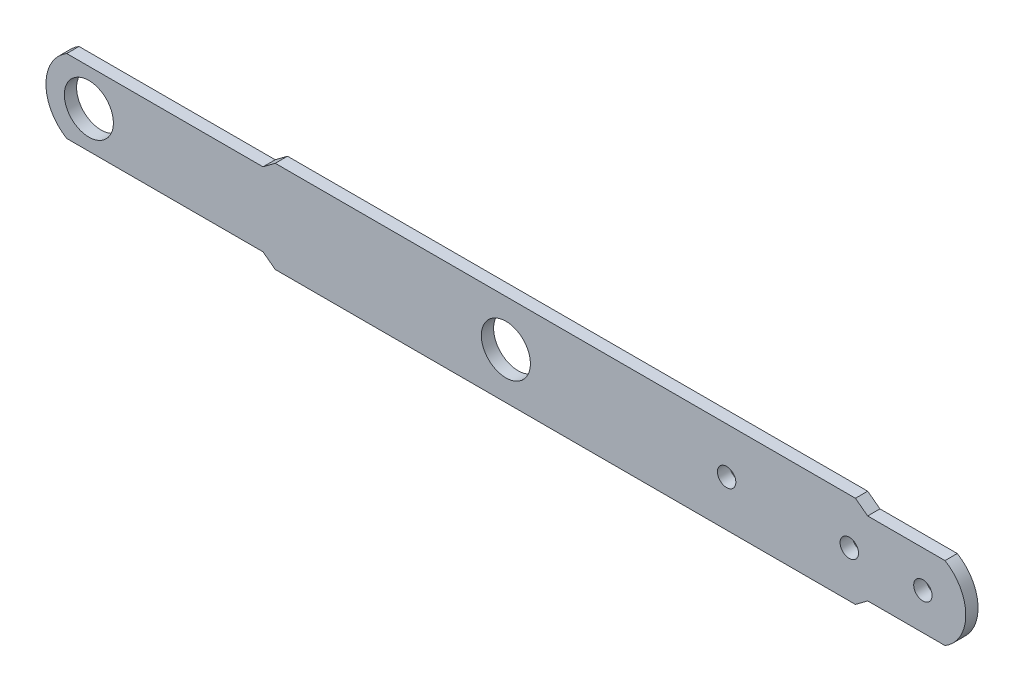
ISO-10303-21;
HEADER;
FILE_DESCRIPTION(('STEP AP214'),'2;1');
FILE_NAME('part.step','',(''),(''),'','','');
FILE_SCHEMA(('AUTOMOTIVE_DESIGN { 1 0 10303 214 1 1 1 1 }'));
ENDSEC;
DATA;
#1=APPLICATION_CONTEXT('core data for automotive mechanical design processes');
#2=APPLICATION_PROTOCOL_DEFINITION('international standard','automotive_design',2000,#1);
#3=PRODUCT_CONTEXT('',#1,'mechanical');
#4=PRODUCT('Part','Part','',(#3));
#5=PRODUCT_RELATED_PRODUCT_CATEGORY('part','',(#4));
#6=PRODUCT_DEFINITION_FORMATION('','',#4);
#7=PRODUCT_DEFINITION_CONTEXT('part definition',#1,'design');
#8=PRODUCT_DEFINITION('design','',#6,#7);
#9=PRODUCT_DEFINITION_SHAPE('','',#8);
#10=(LENGTH_UNIT() NAMED_UNIT(*) SI_UNIT(.MILLI.,.METRE.));
#11=(NAMED_UNIT(*) PLANE_ANGLE_UNIT() SI_UNIT($,.RADIAN.));
#12=(NAMED_UNIT(*) SI_UNIT($,.STERADIAN.) SOLID_ANGLE_UNIT());
#13=UNCERTAINTY_MEASURE_WITH_UNIT(LENGTH_MEASURE(1.E-05),#10,'distance_accuracy_value','');
#14=(GEOMETRIC_REPRESENTATION_CONTEXT(3) GLOBAL_UNCERTAINTY_ASSIGNED_CONTEXT((#13)) GLOBAL_UNIT_ASSIGNED_CONTEXT((#10,
#11,#12)) REPRESENTATION_CONTEXT('',''));
#15=CARTESIAN_POINT('',(0.,0.,0.));
#16=DIRECTION('',(0.,0.,1.));
#17=DIRECTION('',(1.,0.,0.));
#18=AXIS2_PLACEMENT_3D('',#15,#16,#17);
#19=CARTESIAN_POINT('',(-68.,0.,2.));
#20=DIRECTION('',(0.,0.,-1.));
#21=DIRECTION('',(-1.,0.,0.));
#22=AXIS2_PLACEMENT_3D('',#19,#20,#21);
#23=PLANE('',#22);
#24=CARTESIAN_POINT('',(0.,0.,2.));
#25=DIRECTION('',(0.,0.,1.));
#26=DIRECTION('',(1.,0.,0.));
#27=AXIS2_PLACEMENT_3D('',#24,#25,#26);
#28=CIRCLE('',#27,4.);
#29=CARTESIAN_POINT('',(4.,0.,2.));
#30=VERTEX_POINT('',#29);
#31=EDGE_CURVE('E313',#30,#30,#28,.T.);
#32=ORIENTED_EDGE('',*,*,#31,.F.);
#33=EDGE_LOOP('',(#32));
#34=FACE_BOUND('',#33,.T.);
#35=CARTESIAN_POINT('',(-68.,0.,2.));
#36=DIRECTION('',(0.,0.,1.));
#37=DIRECTION('',(-1.,0.,0.));
#38=AXIS2_PLACEMENT_3D('',#35,#36,#37);
#39=CIRCLE('',#38,4.00000000000001);
#40=CARTESIAN_POINT('',(-72.,0.,2.));
#41=VERTEX_POINT('',#40);
#42=EDGE_CURVE('E325',#41,#41,#39,.T.);
#43=ORIENTED_EDGE('',*,*,#42,.F.);
#44=EDGE_LOOP('',(#43));
#45=FACE_BOUND('',#44,.T.);
#46=DIRECTION('',(-1.,0.,0.));
#47=VECTOR('',#46,1.);
#48=CARTESIAN_POINT('',(57.,7.49999999999998,2.));
#49=LINE('',#48,#47);
#50=CARTESIAN_POINT('',(57.,7.49999999999998,2.));
#51=VERTEX_POINT('',#50);
#52=CARTESIAN_POINT('',(-37.605551275464,7.49999999999999,2.));
#53=VERTEX_POINT('',#52);
#54=EDGE_CURVE('E169',#51,#53,#49,.T.);
#55=ORIENTED_EDGE('',*,*,#54,.T.);
#56=DIRECTION('',(-0.800000000000004,-0.599999999999995,0.));
#57=VECTOR('',#56,1.);
#58=CARTESIAN_POINT('',(-37.605551275464,7.49999999999999,2.));
#59=LINE('',#58,#57);
#60=CARTESIAN_POINT('',(-39.605551275464,6.,2.));
#61=VERTEX_POINT('',#60);
#62=EDGE_CURVE('E138',#53,#61,#59,.T.);
#63=ORIENTED_EDGE('',*,*,#62,.T.);
#64=DIRECTION('',(-1.,0.,0.));
#65=VECTOR('',#64,1.);
#66=CARTESIAN_POINT('',(-71.605551275464,5.99999999999999,2.));
#67=LINE('',#66,#65);
#68=CARTESIAN_POINT('',(-71.605551275464,5.99999999999999,2.));
#69=VERTEX_POINT('',#68);
#70=EDGE_CURVE('E172',#61,#69,#67,.T.);
#71=ORIENTED_EDGE('',*,*,#70,.T.);
#72=CARTESIAN_POINT('',(-68.,0.,2.));
#73=DIRECTION('',(0.,0.,1.));
#74=DIRECTION('',(-1.,0.,0.));
#75=AXIS2_PLACEMENT_3D('',#72,#73,#74);
#76=CIRCLE('',#75,7.);
#77=CARTESIAN_POINT('',(-71.605551275464,-5.99999999999999,2.));
#78=VERTEX_POINT('',#77);
#79=EDGE_CURVE('E174',#69,#78,#76,.T.);
#80=ORIENTED_EDGE('',*,*,#79,.T.);
#81=DIRECTION('',(1.,0.,0.));
#82=VECTOR('',#81,1.);
#83=CARTESIAN_POINT('',(-71.605551275464,-5.99999999999999,2.));
#84=LINE('',#83,#82);
#85=CARTESIAN_POINT('',(-39.605551275464,-6.,2.));
#86=VERTEX_POINT('',#85);
#87=EDGE_CURVE('E176',#78,#86,#84,.T.);
#88=ORIENTED_EDGE('',*,*,#87,.T.);
#89=DIRECTION('',(0.800000000000004,-0.599999999999995,0.));
#90=VECTOR('',#89,1.);
#91=CARTESIAN_POINT('',(-37.605551275464,-7.49999999999999,2.));
#92=LINE('',#91,#90);
#93=CARTESIAN_POINT('',(-37.605551275464,-7.49999999999999,2.));
#94=VERTEX_POINT('',#93);
#95=EDGE_CURVE('E178',#86,#94,#92,.T.);
#96=ORIENTED_EDGE('',*,*,#95,.T.);
#97=DIRECTION('',(1.,0.,0.));
#98=VECTOR('',#97,1.);
#99=CARTESIAN_POINT('',(57.,-7.49999999999998,2.));
#100=LINE('',#99,#98);
#101=CARTESIAN_POINT('',(57.,-7.49999999999998,2.));
#102=VERTEX_POINT('',#101);
#103=EDGE_CURVE('E180',#94,#102,#100,.T.);
#104=ORIENTED_EDGE('',*,*,#103,.T.);
#105=DIRECTION('',(0.800000000000002,0.599999999999997,0.));
#106=VECTOR('',#105,1.);
#107=CARTESIAN_POINT('',(59.,-6.,2.));
#108=LINE('',#107,#106);
#109=CARTESIAN_POINT('',(59.,-6.,2.));
#110=VERTEX_POINT('',#109);
#111=EDGE_CURVE('E182',#102,#110,#108,.T.);
#112=ORIENTED_EDGE('',*,*,#111,.T.);
#113=DIRECTION('',(1.,0.,0.));
#114=VECTOR('',#113,1.);
#115=CARTESIAN_POINT('',(71.605551275464,-5.99999999999999,2.));
#116=LINE('',#115,#114);
#117=CARTESIAN_POINT('',(71.605551275464,-6.,2.));
#118=VERTEX_POINT('',#117);
#119=EDGE_CURVE('E184',#110,#118,#116,.T.);
#120=ORIENTED_EDGE('',*,*,#119,.T.);
#121=CARTESIAN_POINT('',(68.,0.,2.));
#122=DIRECTION('',(0.,0.,1.));
#123=DIRECTION('',(1.,0.,0.));
#124=AXIS2_PLACEMENT_3D('',#121,#122,#123);
#125=CIRCLE('',#124,7.);
#126=CARTESIAN_POINT('',(71.605551275464,5.99999999999999,2.));
#127=VERTEX_POINT('',#126);
#128=EDGE_CURVE('E186',#118,#127,#125,.T.);
#129=ORIENTED_EDGE('',*,*,#128,.T.);
#130=DIRECTION('',(-1.,0.,0.));
#131=VECTOR('',#130,1.);
#132=CARTESIAN_POINT('',(71.605551275464,5.99999999999999,2.));
#133=LINE('',#132,#131);
#134=CARTESIAN_POINT('',(59.,6.,2.));
#135=VERTEX_POINT('',#134);
#136=EDGE_CURVE('E55',#127,#135,#133,.T.);
#137=ORIENTED_EDGE('',*,*,#136,.T.);
#138=DIRECTION('',(-0.800000000000002,0.599999999999997,0.));
#139=VECTOR('',#138,1.);
#140=CARTESIAN_POINT('',(59.,6.,2.));
#141=LINE('',#140,#139);
#142=EDGE_CURVE('E50',#135,#51,#141,.T.);
#143=ORIENTED_EDGE('',*,*,#142,.T.);
#144=EDGE_LOOP('',(#55,#63,#71,#80,#88,#96,#104,#112,#120,#129,#137,#143));
#145=FACE_BOUND('',#144,.T.);
#146=CARTESIAN_POINT('',(68.,0.,2.));
#147=DIRECTION('',(0.,0.,1.));
#148=DIRECTION('',(1.,0.,0.));
#149=AXIS2_PLACEMENT_3D('',#146,#147,#148);
#150=CIRCLE('',#149,1.5);
#151=CARTESIAN_POINT('',(69.5,0.,2.));
#152=VERTEX_POINT('',#151);
#153=EDGE_CURVE('E143',#152,#152,#150,.T.);
#154=ORIENTED_EDGE('',*,*,#153,.F.);
#155=EDGE_LOOP('',(#154));
#156=FACE_BOUND('',#155,.T.);
#157=CARTESIAN_POINT('',(56.,0.,2.));
#158=DIRECTION('',(0.,0.,1.));
#159=DIRECTION('',(1.,0.,0.));
#160=AXIS2_PLACEMENT_3D('',#157,#158,#159);
#161=CIRCLE('',#160,1.5);
#162=CARTESIAN_POINT('',(57.5,0.,2.));
#163=VERTEX_POINT('',#162);
#164=EDGE_CURVE('E319',#163,#163,#161,.T.);
#165=ORIENTED_EDGE('',*,*,#164,.F.);
#166=EDGE_LOOP('',(#165));
#167=FACE_BOUND('',#166,.T.);
#168=CARTESIAN_POINT('',(36.,0.,2.));
#169=DIRECTION('',(0.,0.,1.));
#170=DIRECTION('',(1.,0.,0.));
#171=AXIS2_PLACEMENT_3D('',#168,#169,#170);
#172=CIRCLE('',#171,1.5);
#173=CARTESIAN_POINT('',(37.5,0.,2.));
#174=VERTEX_POINT('',#173);
#175=EDGE_CURVE('E302',#174,#174,#172,.T.);
#176=ORIENTED_EDGE('',*,*,#175,.F.);
#177=EDGE_LOOP('',(#176));
#178=FACE_BOUND('',#177,.T.);
#179=ADVANCED_FACE('F35',(#34,#45,#145,#156,#167,#178),#23,.F.);
#180=CARTESIAN_POINT('',(-68.,0.,0.));
#181=DIRECTION('',(0.,0.,-1.));
#182=DIRECTION('',(-1.,0.,0.));
#183=AXIS2_PLACEMENT_3D('',#180,#181,#182);
#184=PLANE('',#183);
#185=CARTESIAN_POINT('',(0.,0.,0.));
#186=DIRECTION('',(0.,0.,1.));
#187=DIRECTION('',(1.,0.,0.));
#188=AXIS2_PLACEMENT_3D('',#185,#186,#187);
#189=CIRCLE('',#188,4.);
#190=CARTESIAN_POINT('',(4.,0.,0.));
#191=VERTEX_POINT('',#190);
#192=EDGE_CURVE('E308',#191,#191,#189,.T.);
#193=ORIENTED_EDGE('',*,*,#192,.T.);
#194=EDGE_LOOP('',(#193));
#195=FACE_BOUND('',#194,.T.);
#196=CARTESIAN_POINT('',(-68.,0.,0.));
#197=DIRECTION('',(0.,0.,1.));
#198=DIRECTION('',(-1.,0.,0.));
#199=AXIS2_PLACEMENT_3D('',#196,#197,#198);
#200=CIRCLE('',#199,4.00000000000001);
#201=CARTESIAN_POINT('',(-72.,0.,0.));
#202=VERTEX_POINT('',#201);
#203=EDGE_CURVE('E322',#202,#202,#200,.T.);
#204=ORIENTED_EDGE('',*,*,#203,.T.);
#205=EDGE_LOOP('',(#204));
#206=FACE_BOUND('',#205,.T.);
#207=DIRECTION('',(-1.,0.,0.));
#208=VECTOR('',#207,1.);
#209=CARTESIAN_POINT('',(57.,7.49999999999998,0.));
#210=LINE('',#209,#208);
#211=CARTESIAN_POINT('',(57.,7.49999999999998,0.));
#212=VERTEX_POINT('',#211);
#213=CARTESIAN_POINT('',(-37.605551275464,7.49999999999999,0.));
#214=VERTEX_POINT('',#213);
#215=EDGE_CURVE('E129',#212,#214,#210,.T.);
#216=ORIENTED_EDGE('',*,*,#215,.F.);
#217=DIRECTION('',(-0.800000000000002,0.599999999999997,0.));
#218=VECTOR('',#217,1.);
#219=CARTESIAN_POINT('',(59.,6.,0.));
#220=LINE('',#219,#218);
#221=CARTESIAN_POINT('',(59.,6.,0.));
#222=VERTEX_POINT('',#221);
#223=EDGE_CURVE('E167',#222,#212,#220,.T.);
#224=ORIENTED_EDGE('',*,*,#223,.F.);
#225=DIRECTION('',(-1.,0.,0.));
#226=VECTOR('',#225,1.);
#227=CARTESIAN_POINT('',(71.605551275464,5.99999999999999,0.));
#228=LINE('',#227,#226);
#229=CARTESIAN_POINT('',(71.605551275464,5.99999999999999,0.));
#230=VERTEX_POINT('',#229);
#231=EDGE_CURVE('E165',#230,#222,#228,.T.);
#232=ORIENTED_EDGE('',*,*,#231,.F.);
#233=CARTESIAN_POINT('',(68.,0.,0.));
#234=DIRECTION('',(0.,0.,1.));
#235=DIRECTION('',(1.,0.,0.));
#236=AXIS2_PLACEMENT_3D('',#233,#234,#235);
#237=CIRCLE('',#236,7.);
#238=CARTESIAN_POINT('',(71.605551275464,-6.,0.));
#239=VERTEX_POINT('',#238);
#240=EDGE_CURVE('E163',#239,#230,#237,.T.);
#241=ORIENTED_EDGE('',*,*,#240,.F.);
#242=DIRECTION('',(1.,0.,0.));
#243=VECTOR('',#242,1.);
#244=CARTESIAN_POINT('',(71.605551275464,-5.99999999999999,0.));
#245=LINE('',#244,#243);
#246=CARTESIAN_POINT('',(59.,-6.,0.));
#247=VERTEX_POINT('',#246);
#248=EDGE_CURVE('E161',#247,#239,#245,.T.);
#249=ORIENTED_EDGE('',*,*,#248,.F.);
#250=DIRECTION('',(0.800000000000002,0.599999999999997,0.));
#251=VECTOR('',#250,1.);
#252=CARTESIAN_POINT('',(59.,-6.,0.));
#253=LINE('',#252,#251);
#254=CARTESIAN_POINT('',(57.,-7.49999999999998,0.));
#255=VERTEX_POINT('',#254);
#256=EDGE_CURVE('E159',#255,#247,#253,.T.);
#257=ORIENTED_EDGE('',*,*,#256,.F.);
#258=DIRECTION('',(1.,0.,0.));
#259=VECTOR('',#258,1.);
#260=CARTESIAN_POINT('',(57.,-7.49999999999998,0.));
#261=LINE('',#260,#259);
#262=CARTESIAN_POINT('',(-37.605551275464,-7.49999999999999,0.));
#263=VERTEX_POINT('',#262);
#264=EDGE_CURVE('E157',#263,#255,#261,.T.);
#265=ORIENTED_EDGE('',*,*,#264,.F.);
#266=DIRECTION('',(0.800000000000004,-0.599999999999995,0.));
#267=VECTOR('',#266,1.);
#268=CARTESIAN_POINT('',(-37.605551275464,-7.49999999999999,0.));
#269=LINE('',#268,#267);
#270=CARTESIAN_POINT('',(-39.605551275464,-6.,0.));
#271=VERTEX_POINT('',#270);
#272=EDGE_CURVE('E155',#271,#263,#269,.T.);
#273=ORIENTED_EDGE('',*,*,#272,.F.);
#274=DIRECTION('',(1.,0.,0.));
#275=VECTOR('',#274,1.);
#276=CARTESIAN_POINT('',(-71.605551275464,-5.99999999999999,0.));
#277=LINE('',#276,#275);
#278=CARTESIAN_POINT('',(-71.605551275464,-5.99999999999999,0.));
#279=VERTEX_POINT('',#278);
#280=EDGE_CURVE('E153',#279,#271,#277,.T.);
#281=ORIENTED_EDGE('',*,*,#280,.F.);
#282=CARTESIAN_POINT('',(-68.,0.,0.));
#283=DIRECTION('',(0.,0.,1.));
#284=DIRECTION('',(-1.,0.,0.));
#285=AXIS2_PLACEMENT_3D('',#282,#283,#284);
#286=CIRCLE('',#285,7.);
#287=CARTESIAN_POINT('',(-71.605551275464,5.99999999999999,0.));
#288=VERTEX_POINT('',#287);
#289=EDGE_CURVE('E151',#288,#279,#286,.T.);
#290=ORIENTED_EDGE('',*,*,#289,.F.);
#291=DIRECTION('',(-1.,0.,0.));
#292=VECTOR('',#291,1.);
#293=CARTESIAN_POINT('',(-71.605551275464,5.99999999999999,0.));
#294=LINE('',#293,#292);
#295=CARTESIAN_POINT('',(-39.605551275464,6.,0.));
#296=VERTEX_POINT('',#295);
#297=EDGE_CURVE('E131',#296,#288,#294,.T.);
#298=ORIENTED_EDGE('',*,*,#297,.F.);
#299=DIRECTION('',(-0.800000000000004,-0.599999999999995,0.));
#300=VECTOR('',#299,1.);
#301=CARTESIAN_POINT('',(-37.605551275464,7.49999999999999,0.));
#302=LINE('',#301,#300);
#303=EDGE_CURVE('E124',#214,#296,#302,.T.);
#304=ORIENTED_EDGE('',*,*,#303,.F.);
#305=EDGE_LOOP('',(#216,#224,#232,#241,#249,#257,#265,#273,#281,#290,#298,#304));
#306=FACE_BOUND('',#305,.T.);
#307=CARTESIAN_POINT('',(68.,0.,0.));
#308=DIRECTION('',(0.,0.,1.));
#309=DIRECTION('',(1.,0.,0.));
#310=AXIS2_PLACEMENT_3D('',#307,#308,#309);
#311=CIRCLE('',#310,1.5);
#312=CARTESIAN_POINT('',(69.5,0.,0.));
#313=VERTEX_POINT('',#312);
#314=EDGE_CURVE('E146',#313,#313,#311,.T.);
#315=ORIENTED_EDGE('',*,*,#314,.T.);
#316=EDGE_LOOP('',(#315));
#317=FACE_BOUND('',#316,.T.);
#318=CARTESIAN_POINT('',(56.,0.,0.));
#319=DIRECTION('',(0.,0.,1.));
#320=DIRECTION('',(1.,0.,0.));
#321=AXIS2_PLACEMENT_3D('',#318,#319,#320);
#322=CIRCLE('',#321,1.5);
#323=CARTESIAN_POINT('',(57.5,0.,0.));
#324=VERTEX_POINT('',#323);
#325=EDGE_CURVE('E316',#324,#324,#322,.T.);
#326=ORIENTED_EDGE('',*,*,#325,.T.);
#327=EDGE_LOOP('',(#326));
#328=FACE_BOUND('',#327,.T.);
#329=CARTESIAN_POINT('',(36.,0.,0.));
#330=DIRECTION('',(0.,0.,1.));
#331=DIRECTION('',(1.,0.,0.));
#332=AXIS2_PLACEMENT_3D('',#329,#330,#331);
#333=CIRCLE('',#332,1.5);
#334=CARTESIAN_POINT('',(37.5,0.,0.));
#335=VERTEX_POINT('',#334);
#336=EDGE_CURVE('E305',#335,#335,#333,.T.);
#337=ORIENTED_EDGE('',*,*,#336,.T.);
#338=EDGE_LOOP('',(#337));
#339=FACE_BOUND('',#338,.T.);
#340=ADVANCED_FACE('F125',(#195,#206,#306,#317,#328,#339),#184,.T.);
#341=CARTESIAN_POINT('',(57.,7.49999999999998,2.));
#342=DIRECTION('',(0.,-1.,0.));
#343=DIRECTION('',(1.,0.,0.));
#344=AXIS2_PLACEMENT_3D('',#341,#342,#343);
#345=PLANE('',#344);
#346=ORIENTED_EDGE('',*,*,#215,.T.);
#347=DIRECTION('',(0.,0.,-1.));
#348=VECTOR('',#347,1.);
#349=CARTESIAN_POINT('',(-37.605551275464,7.49999999999999,2.));
#350=LINE('',#349,#348);
#351=EDGE_CURVE('E11',#53,#214,#350,.T.);
#352=ORIENTED_EDGE('',*,*,#351,.F.);
#353=ORIENTED_EDGE('',*,*,#54,.F.);
#354=DIRECTION('',(0.,0.,-1.));
#355=VECTOR('',#354,1.);
#356=CARTESIAN_POINT('',(57.,7.49999999999998,2.));
#357=LINE('',#356,#355);
#358=EDGE_CURVE('E142',#51,#212,#357,.T.);
#359=ORIENTED_EDGE('',*,*,#358,.T.);
#360=EDGE_LOOP('',(#346,#352,#353,#359));
#361=FACE_BOUND('',#360,.T.);
#362=ADVANCED_FACE('F37',(#361),#345,.F.);
#363=CARTESIAN_POINT('',(-37.605551275464,7.49999999999999,2.));
#364=DIRECTION('',(0.599999999999995,-0.800000000000004,0.));
#365=DIRECTION('',(0.800000000000004,0.599999999999995,0.));
#366=AXIS2_PLACEMENT_3D('',#363,#364,#365);
#367=PLANE('',#366);
#368=ORIENTED_EDGE('',*,*,#303,.T.);
#369=DIRECTION('',(0.,0.,-1.));
#370=VECTOR('',#369,1.);
#371=CARTESIAN_POINT('',(-39.605551275464,6.,2.));
#372=LINE('',#371,#370);
#373=EDGE_CURVE('E43',#61,#296,#372,.T.);
#374=ORIENTED_EDGE('',*,*,#373,.F.);
#375=ORIENTED_EDGE('',*,*,#62,.F.);
#376=ORIENTED_EDGE('',*,*,#351,.T.);
#377=EDGE_LOOP('',(#368,#374,#375,#376));
#378=FACE_BOUND('',#377,.T.);
#379=ADVANCED_FACE('F137',(#378),#367,.F.);
#380=CARTESIAN_POINT('',(-71.605551275464,5.99999999999999,2.));
#381=DIRECTION('',(0.,-1.,0.));
#382=DIRECTION('',(1.,0.,0.));
#383=AXIS2_PLACEMENT_3D('',#380,#381,#382);
#384=PLANE('',#383);
#385=ORIENTED_EDGE('',*,*,#297,.T.);
#386=DIRECTION('',(0.,0.,-1.));
#387=VECTOR('',#386,1.);
#388=CARTESIAN_POINT('',(-71.605551275464,5.99999999999999,2.));
#389=LINE('',#388,#387);
#390=EDGE_CURVE('E215',#69,#288,#389,.T.);
#391=ORIENTED_EDGE('',*,*,#390,.F.);
#392=ORIENTED_EDGE('',*,*,#70,.F.);
#393=ORIENTED_EDGE('',*,*,#373,.T.);
#394=EDGE_LOOP('',(#385,#391,#392,#393));
#395=FACE_BOUND('',#394,.T.);
#396=ADVANCED_FACE('F219',(#395),#384,.F.);
#397=CARTESIAN_POINT('',(-68.,0.,2.));
#398=DIRECTION('',(0.,0.,-1.));
#399=DIRECTION('',(-1.,0.,0.));
#400=AXIS2_PLACEMENT_3D('',#397,#398,#399);
#401=CYLINDRICAL_SURFACE('',#400,7.);
#402=ORIENTED_EDGE('',*,*,#289,.T.);
#403=DIRECTION('',(0.,0.,-1.));
#404=VECTOR('',#403,1.);
#405=CARTESIAN_POINT('',(-71.605551275464,-5.99999999999999,2.));
#406=LINE('',#405,#404);
#407=EDGE_CURVE('E212',#78,#279,#406,.T.);
#408=ORIENTED_EDGE('',*,*,#407,.F.);
#409=ORIENTED_EDGE('',*,*,#79,.F.);
#410=ORIENTED_EDGE('',*,*,#390,.T.);
#411=EDGE_LOOP('',(#402,#408,#409,#410));
#412=FACE_BOUND('',#411,.T.);
#413=ADVANCED_FACE('F227',(#412),#401,.T.);
#414=CARTESIAN_POINT('',(-71.605551275464,-5.99999999999999,2.));
#415=DIRECTION('',(0.,1.,0.));
#416=DIRECTION('',(-1.,0.,0.));
#417=AXIS2_PLACEMENT_3D('',#414,#415,#416);
#418=PLANE('',#417);
#419=ORIENTED_EDGE('',*,*,#280,.T.);
#420=DIRECTION('',(0.,0.,-1.));
#421=VECTOR('',#420,1.);
#422=CARTESIAN_POINT('',(-39.605551275464,-6.,2.));
#423=LINE('',#422,#421);
#424=EDGE_CURVE('E209',#86,#271,#423,.T.);
#425=ORIENTED_EDGE('',*,*,#424,.F.);
#426=ORIENTED_EDGE('',*,*,#87,.F.);
#427=ORIENTED_EDGE('',*,*,#407,.T.);
#428=EDGE_LOOP('',(#419,#425,#426,#427));
#429=FACE_BOUND('',#428,.T.);
#430=ADVANCED_FACE('F230',(#429),#418,.F.);
#431=CARTESIAN_POINT('',(-37.605551275464,-7.49999999999999,2.));
#432=DIRECTION('',(0.599999999999995,0.800000000000004,0.));
#433=DIRECTION('',(-0.800000000000004,0.599999999999995,0.));
#434=AXIS2_PLACEMENT_3D('',#431,#432,#433);
#435=PLANE('',#434);
#436=ORIENTED_EDGE('',*,*,#272,.T.);
#437=DIRECTION('',(0.,0.,-1.));
#438=VECTOR('',#437,1.);
#439=CARTESIAN_POINT('',(-37.605551275464,-7.49999999999999,2.));
#440=LINE('',#439,#438);
#441=EDGE_CURVE('E206',#94,#263,#440,.T.);
#442=ORIENTED_EDGE('',*,*,#441,.F.);
#443=ORIENTED_EDGE('',*,*,#95,.F.);
#444=ORIENTED_EDGE('',*,*,#424,.T.);
#445=EDGE_LOOP('',(#436,#442,#443,#444));
#446=FACE_BOUND('',#445,.T.);
#447=ADVANCED_FACE('F235',(#446),#435,.F.);
#448=CARTESIAN_POINT('',(57.,-7.49999999999998,2.));
#449=DIRECTION('',(0.,1.,0.));
#450=DIRECTION('',(-1.,0.,0.));
#451=AXIS2_PLACEMENT_3D('',#448,#449,#450);
#452=PLANE('',#451);
#453=ORIENTED_EDGE('',*,*,#264,.T.);
#454=DIRECTION('',(0.,0.,-1.));
#455=VECTOR('',#454,1.);
#456=CARTESIAN_POINT('',(57.,-7.49999999999998,2.));
#457=LINE('',#456,#455);
#458=EDGE_CURVE('E203',#102,#255,#457,.T.);
#459=ORIENTED_EDGE('',*,*,#458,.F.);
#460=ORIENTED_EDGE('',*,*,#103,.F.);
#461=ORIENTED_EDGE('',*,*,#441,.T.);
#462=EDGE_LOOP('',(#453,#459,#460,#461));
#463=FACE_BOUND('',#462,.T.);
#464=ADVANCED_FACE('F241',(#463),#452,.F.);
#465=CARTESIAN_POINT('',(59.,-6.,2.));
#466=DIRECTION('',(-0.599999999999997,0.800000000000002,0.));
#467=DIRECTION('',(-0.800000000000002,-0.599999999999997,0.));
#468=AXIS2_PLACEMENT_3D('',#465,#466,#467);
#469=PLANE('',#468);
#470=ORIENTED_EDGE('',*,*,#256,.T.);
#471=DIRECTION('',(0.,0.,-1.));
#472=VECTOR('',#471,1.);
#473=CARTESIAN_POINT('',(59.,-6.,2.));
#474=LINE('',#473,#472);
#475=EDGE_CURVE('E200',#110,#247,#474,.T.);
#476=ORIENTED_EDGE('',*,*,#475,.F.);
#477=ORIENTED_EDGE('',*,*,#111,.F.);
#478=ORIENTED_EDGE('',*,*,#458,.T.);
#479=EDGE_LOOP('',(#470,#476,#477,#478));
#480=FACE_BOUND('',#479,.T.);
#481=ADVANCED_FACE('F245',(#480),#469,.F.);
#482=CARTESIAN_POINT('',(71.605551275464,-5.99999999999999,2.));
#483=DIRECTION('',(0.,1.,0.));
#484=DIRECTION('',(-1.,0.,0.));
#485=AXIS2_PLACEMENT_3D('',#482,#483,#484);
#486=PLANE('',#485);
#487=ORIENTED_EDGE('',*,*,#248,.T.);
#488=DIRECTION('',(0.,0.,-1.));
#489=VECTOR('',#488,1.);
#490=CARTESIAN_POINT('',(71.605551275464,-6.,2.));
#491=LINE('',#490,#489);
#492=EDGE_CURVE('E197',#118,#239,#491,.T.);
#493=ORIENTED_EDGE('',*,*,#492,.F.);
#494=ORIENTED_EDGE('',*,*,#119,.F.);
#495=ORIENTED_EDGE('',*,*,#475,.T.);
#496=EDGE_LOOP('',(#487,#493,#494,#495));
#497=FACE_BOUND('',#496,.T.);
#498=ADVANCED_FACE('F250',(#497),#486,.F.);
#499=CARTESIAN_POINT('',(68.,0.,2.));
#500=DIRECTION('',(0.,0.,-1.));
#501=DIRECTION('',(-1.,0.,0.));
#502=AXIS2_PLACEMENT_3D('',#499,#500,#501);
#503=CYLINDRICAL_SURFACE('',#502,7.);
#504=ORIENTED_EDGE('',*,*,#240,.T.);
#505=DIRECTION('',(0.,0.,-1.));
#506=VECTOR('',#505,1.);
#507=CARTESIAN_POINT('',(71.605551275464,5.99999999999999,2.));
#508=LINE('',#507,#506);
#509=EDGE_CURVE('E194',#127,#230,#508,.T.);
#510=ORIENTED_EDGE('',*,*,#509,.F.);
#511=ORIENTED_EDGE('',*,*,#128,.F.);
#512=ORIENTED_EDGE('',*,*,#492,.T.);
#513=EDGE_LOOP('',(#504,#510,#511,#512));
#514=FACE_BOUND('',#513,.T.);
#515=ADVANCED_FACE('F254',(#514),#503,.T.);
#516=CARTESIAN_POINT('',(71.605551275464,5.99999999999999,2.));
#517=DIRECTION('',(0.,-1.,0.));
#518=DIRECTION('',(1.,0.,0.));
#519=AXIS2_PLACEMENT_3D('',#516,#517,#518);
#520=PLANE('',#519);
#521=ORIENTED_EDGE('',*,*,#231,.T.);
#522=DIRECTION('',(0.,0.,-1.));
#523=VECTOR('',#522,1.);
#524=CARTESIAN_POINT('',(59.,6.,2.));
#525=LINE('',#524,#523);
#526=EDGE_CURVE('E191',#135,#222,#525,.T.);
#527=ORIENTED_EDGE('',*,*,#526,.F.);
#528=ORIENTED_EDGE('',*,*,#136,.F.);
#529=ORIENTED_EDGE('',*,*,#509,.T.);
#530=EDGE_LOOP('',(#521,#527,#528,#529));
#531=FACE_BOUND('',#530,.T.);
#532=ADVANCED_FACE('F258',(#531),#520,.F.);
#533=CARTESIAN_POINT('',(59.,6.,2.));
#534=DIRECTION('',(-0.599999999999997,-0.800000000000002,0.));
#535=DIRECTION('',(0.800000000000002,-0.599999999999997,0.));
#536=AXIS2_PLACEMENT_3D('',#533,#534,#535);
#537=PLANE('',#536);
#538=ORIENTED_EDGE('',*,*,#223,.T.);
#539=ORIENTED_EDGE('',*,*,#358,.F.);
#540=ORIENTED_EDGE('',*,*,#142,.F.);
#541=ORIENTED_EDGE('',*,*,#526,.T.);
#542=EDGE_LOOP('',(#538,#539,#540,#541));
#543=FACE_BOUND('',#542,.T.);
#544=ADVANCED_FACE('F260',(#543),#537,.F.);
#545=CARTESIAN_POINT('',(68.,0.,2.));
#546=DIRECTION('',(0.,0.,-1.));
#547=DIRECTION('',(-1.,0.,0.));
#548=AXIS2_PLACEMENT_3D('',#545,#546,#547);
#549=CYLINDRICAL_SURFACE('',#548,1.5);
#550=ORIENTED_EDGE('',*,*,#153,.T.);
#551=EDGE_LOOP('',(#550));
#552=FACE_BOUND('',#551,.T.);
#553=ORIENTED_EDGE('',*,*,#314,.F.);
#554=EDGE_LOOP('',(#553));
#555=FACE_BOUND('',#554,.T.);
#556=ADVANCED_FACE('F262',(#552,#555),#549,.F.);
#557=CARTESIAN_POINT('',(-68.,0.,2.));
#558=DIRECTION('',(0.,0.,-1.));
#559=DIRECTION('',(-1.,0.,0.));
#560=AXIS2_PLACEMENT_3D('',#557,#558,#559);
#561=CYLINDRICAL_SURFACE('',#560,4.00000000000001);
#562=ORIENTED_EDGE('',*,*,#42,.T.);
#563=EDGE_LOOP('',(#562));
#564=FACE_BOUND('',#563,.T.);
#565=ORIENTED_EDGE('',*,*,#203,.F.);
#566=EDGE_LOOP('',(#565));
#567=FACE_BOUND('',#566,.T.);
#568=ADVANCED_FACE('F268',(#564,#567),#561,.F.);
#569=CARTESIAN_POINT('',(56.,0.,2.));
#570=DIRECTION('',(0.,0.,-1.));
#571=DIRECTION('',(-1.,0.,0.));
#572=AXIS2_PLACEMENT_3D('',#569,#570,#571);
#573=CYLINDRICAL_SURFACE('',#572,1.5);
#574=ORIENTED_EDGE('',*,*,#164,.T.);
#575=EDGE_LOOP('',(#574));
#576=FACE_BOUND('',#575,.T.);
#577=ORIENTED_EDGE('',*,*,#325,.F.);
#578=EDGE_LOOP('',(#577));
#579=FACE_BOUND('',#578,.T.);
#580=ADVANCED_FACE('F285',(#576,#579),#573,.F.);
#581=CARTESIAN_POINT('',(0.,0.,2.));
#582=DIRECTION('',(0.,0.,-1.));
#583=DIRECTION('',(-1.,0.,0.));
#584=AXIS2_PLACEMENT_3D('',#581,#582,#583);
#585=CYLINDRICAL_SURFACE('',#584,4.);
#586=ORIENTED_EDGE('',*,*,#31,.T.);
#587=EDGE_LOOP('',(#586));
#588=FACE_BOUND('',#587,.T.);
#589=ORIENTED_EDGE('',*,*,#192,.F.);
#590=EDGE_LOOP('',(#589));
#591=FACE_BOUND('',#590,.T.);
#592=ADVANCED_FACE('F289',(#588,#591),#585,.F.);
#593=CARTESIAN_POINT('',(36.,0.,2.));
#594=DIRECTION('',(0.,0.,-1.));
#595=DIRECTION('',(-1.,0.,0.));
#596=AXIS2_PLACEMENT_3D('',#593,#594,#595);
#597=CYLINDRICAL_SURFACE('',#596,1.5);
#598=ORIENTED_EDGE('',*,*,#175,.T.);
#599=EDGE_LOOP('',(#598));
#600=FACE_BOUND('',#599,.T.);
#601=ORIENTED_EDGE('',*,*,#336,.F.);
#602=EDGE_LOOP('',(#601));
#603=FACE_BOUND('',#602,.T.);
#604=ADVANCED_FACE('F293',(#600,#603),#597,.F.);
#605=CLOSED_SHELL('',(#179,#340,#362,#379,#396,#413,#430,#447,#464,#481,#498,#515,#532,#544,
#556,#568,#580,#592,#604));
#606=MANIFOLD_SOLID_BREP('B2',#605);
#607=ADVANCED_BREP_SHAPE_REPRESENTATION('',(#18,#606),#14);
#608=SHAPE_DEFINITION_REPRESENTATION(#9,#607);
ENDSEC;
END-ISO-10303-21;
